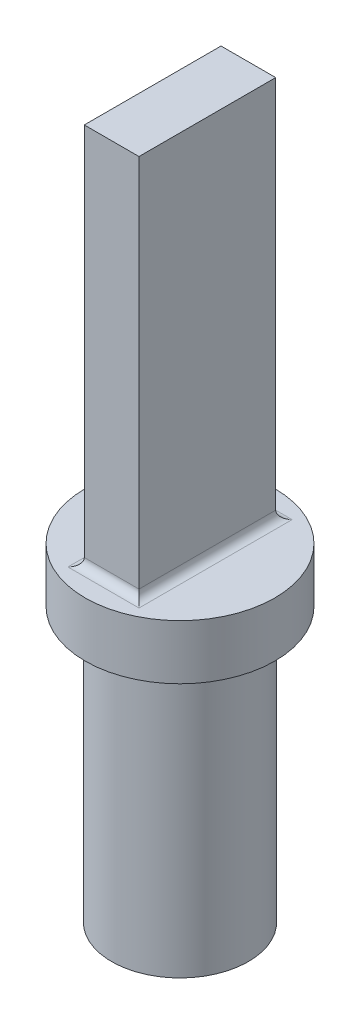
ISO-10303-21;
HEADER;
FILE_DESCRIPTION(('STEP AP214'),'2;1');
FILE_NAME('part.step','',(''),(''),'','','');
FILE_SCHEMA(('AUTOMOTIVE_DESIGN { 1 0 10303 214 1 1 1 1 }'));
ENDSEC;
DATA;
#1=APPLICATION_CONTEXT('core data for automotive mechanical design processes');
#2=APPLICATION_PROTOCOL_DEFINITION('international standard','automotive_design',2000,#1);
#3=PRODUCT_CONTEXT('',#1,'mechanical');
#4=PRODUCT('Part','Part','',(#3));
#5=PRODUCT_RELATED_PRODUCT_CATEGORY('part','',(#4));
#6=PRODUCT_DEFINITION_FORMATION('','',#4);
#7=PRODUCT_DEFINITION_CONTEXT('part definition',#1,'design');
#8=PRODUCT_DEFINITION('design','',#6,#7);
#9=PRODUCT_DEFINITION_SHAPE('','',#8);
#10=(LENGTH_UNIT() NAMED_UNIT(*) SI_UNIT(.MILLI.,.METRE.));
#11=(NAMED_UNIT(*) PLANE_ANGLE_UNIT() SI_UNIT($,.RADIAN.));
#12=(NAMED_UNIT(*) SI_UNIT($,.STERADIAN.) SOLID_ANGLE_UNIT());
#13=UNCERTAINTY_MEASURE_WITH_UNIT(LENGTH_MEASURE(1.E-05),#10,'distance_accuracy_value','');
#14=(GEOMETRIC_REPRESENTATION_CONTEXT(3) GLOBAL_UNCERTAINTY_ASSIGNED_CONTEXT((#13)) GLOBAL_UNIT_ASSIGNED_CONTEXT((#10,
#11,#12)) REPRESENTATION_CONTEXT('',''));
#15=CARTESIAN_POINT('',(0.,0.,0.));
#16=DIRECTION('',(0.,0.,1.));
#17=DIRECTION('',(1.,0.,0.));
#18=AXIS2_PLACEMENT_3D('',#15,#16,#17);
#19=CARTESIAN_POINT('',(0.,-10.,0.));
#20=DIRECTION('',(0.,1.,0.));
#21=DIRECTION('',(0.,0.,1.));
#22=AXIS2_PLACEMENT_3D('',#19,#20,#21);
#23=CYLINDRICAL_SURFACE('',#22,17.325);
#24=CARTESIAN_POINT('',(0.,-10.,0.));
#25=DIRECTION('',(0.,1.,0.));
#26=DIRECTION('',(0.,0.,1.));
#27=AXIS2_PLACEMENT_3D('',#24,#25,#26);
#28=CIRCLE('',#27,17.325);
#29=CARTESIAN_POINT('',(0.,-10.,17.325));
#30=VERTEX_POINT('',#29);
#31=EDGE_CURVE('E123',#30,#30,#28,.T.);
#32=ORIENTED_EDGE('',*,*,#31,.T.);
#33=EDGE_LOOP('',(#32));
#34=FACE_BOUND('',#33,.T.);
#35=CARTESIAN_POINT('',(0.,0.,0.));
#36=DIRECTION('',(0.,1.,0.));
#37=DIRECTION('',(0.,0.,1.));
#38=AXIS2_PLACEMENT_3D('',#35,#36,#37);
#39=CIRCLE('',#38,17.325);
#40=CARTESIAN_POINT('',(0.,0.,17.325));
#41=VERTEX_POINT('',#40);
#42=EDGE_CURVE('E113',#41,#41,#39,.T.);
#43=ORIENTED_EDGE('',*,*,#42,.F.);
#44=EDGE_LOOP('',(#43));
#45=FACE_BOUND('',#44,.T.);
#46=ADVANCED_FACE('F33',(#34,#45),#23,.T.);
#47=CARTESIAN_POINT('',(0.,-10.,0.));
#48=DIRECTION('',(0.,1.,0.));
#49=DIRECTION('',(0.,0.,1.));
#50=AXIS2_PLACEMENT_3D('',#47,#48,#49);
#51=PLANE('',#50);
#52=CARTESIAN_POINT('',(0.,-10.,0.));
#53=DIRECTION('',(0.,-1.,0.));
#54=DIRECTION('',(0.,0.,-1.));
#55=AXIS2_PLACEMENT_3D('',#52,#53,#54);
#56=CIRCLE('',#55,12.5);
#57=CARTESIAN_POINT('',(0.,-10.,-12.5));
#58=VERTEX_POINT('',#57);
#59=EDGE_CURVE('E119',#58,#58,#56,.T.);
#60=ORIENTED_EDGE('',*,*,#59,.F.);
#61=EDGE_LOOP('',(#60));
#62=FACE_BOUND('',#61,.T.);
#63=ORIENTED_EDGE('',*,*,#31,.F.);
#64=EDGE_LOOP('',(#63));
#65=FACE_BOUND('',#64,.T.);
#66=ADVANCED_FACE('F179',(#62,#65),#51,.F.);
#67=CARTESIAN_POINT('',(0.,0.,0.));
#68=DIRECTION('',(0.,1.,0.));
#69=DIRECTION('',(0.,0.,1.));
#70=AXIS2_PLACEMENT_3D('',#67,#68,#69);
#71=PLANE('',#70);
#72=DIRECTION('',(0.,0.,1.));
#73=VECTOR('',#72,1.);
#74=CARTESIAN_POINT('',(-6.5,0.,0.));
#75=LINE('',#74,#73);
#76=CARTESIAN_POINT('',(-6.5,0.,14.));
#77=VERTEX_POINT('',#76);
#78=CARTESIAN_POINT('',(-6.5,0.,-14.));
#79=VERTEX_POINT('',#78);
#80=EDGE_CURVE('E129',#77,#79,#75,.F.);
#81=ORIENTED_EDGE('',*,*,#80,.T.);
#82=DIRECTION('',(-1.,0.,0.));
#83=VECTOR('',#82,1.);
#84=CARTESIAN_POINT('',(0.,0.,-14.));
#85=LINE('',#84,#83);
#86=CARTESIAN_POINT('',(6.5,0.,-14.));
#87=VERTEX_POINT('',#86);
#88=EDGE_CURVE('E135',#79,#87,#85,.F.);
#89=ORIENTED_EDGE('',*,*,#88,.T.);
#90=DIRECTION('',(0.,0.,-1.));
#91=VECTOR('',#90,1.);
#92=CARTESIAN_POINT('',(6.5,0.,0.));
#93=LINE('',#92,#91);
#94=CARTESIAN_POINT('',(6.5,0.,14.));
#95=VERTEX_POINT('',#94);
#96=EDGE_CURVE('E133',#87,#95,#93,.F.);
#97=ORIENTED_EDGE('',*,*,#96,.T.);
#98=DIRECTION('',(1.,0.,0.));
#99=VECTOR('',#98,1.);
#100=CARTESIAN_POINT('',(0.,0.,14.));
#101=LINE('',#100,#99);
#102=EDGE_CURVE('E131',#95,#77,#101,.F.);
#103=ORIENTED_EDGE('',*,*,#102,.T.);
#104=EDGE_LOOP('',(#81,#89,#97,#103));
#105=FACE_BOUND('',#104,.T.);
#106=ORIENTED_EDGE('',*,*,#42,.T.);
#107=EDGE_LOOP('',(#106));
#108=FACE_BOUND('',#107,.T.);
#109=ADVANCED_FACE('F156',(#105,#108),#71,.T.);
#110=CARTESIAN_POINT('',(0.,-60.,0.));
#111=DIRECTION('',(0.,1.,0.));
#112=DIRECTION('',(0.,0.,1.));
#113=AXIS2_PLACEMENT_3D('',#110,#111,#112);
#114=CYLINDRICAL_SURFACE('',#113,12.5);
#115=CARTESIAN_POINT('',(0.,-60.,0.));
#116=DIRECTION('',(0.,-1.,0.));
#117=DIRECTION('',(0.,0.,-1.));
#118=AXIS2_PLACEMENT_3D('',#115,#116,#117);
#119=CIRCLE('',#118,12.5);
#120=CARTESIAN_POINT('',(0.,-60.,-12.5));
#121=VERTEX_POINT('',#120);
#122=EDGE_CURVE('E110',#121,#121,#119,.T.);
#123=ORIENTED_EDGE('',*,*,#122,.F.);
#124=EDGE_LOOP('',(#123));
#125=FACE_BOUND('',#124,.T.);
#126=ORIENTED_EDGE('',*,*,#59,.T.);
#127=EDGE_LOOP('',(#126));
#128=FACE_BOUND('',#127,.T.);
#129=ADVANCED_FACE('F219',(#125,#128),#114,.T.);
#130=CARTESIAN_POINT('',(0.,-60.,0.));
#131=DIRECTION('',(0.,-1.,0.));
#132=DIRECTION('',(0.,0.,-1.));
#133=AXIS2_PLACEMENT_3D('',#130,#131,#132);
#134=PLANE('',#133);
#135=ORIENTED_EDGE('',*,*,#122,.T.);
#136=EDGE_LOOP('',(#135));
#137=FACE_BOUND('',#136,.T.);
#138=ADVANCED_FACE('F210',(#137),#134,.T.);
#139=CARTESIAN_POINT('',(5.,70.,12.5));
#140=DIRECTION('',(-1.,0.,0.));
#141=DIRECTION('',(0.,0.,1.));
#142=AXIS2_PLACEMENT_3D('',#139,#140,#141);
#143=PLANE('',#142);
#144=DIRECTION('',(0.,-1.,0.));
#145=VECTOR('',#144,1.);
#146=CARTESIAN_POINT('',(5.,70.,12.5));
#147=LINE('',#146,#145);
#148=CARTESIAN_POINT('',(5.,70.,12.5));
#149=VERTEX_POINT('',#148);
#150=CARTESIAN_POINT('',(5.,1.5,12.5));
#151=VERTEX_POINT('',#150);
#152=EDGE_CURVE('E166',#149,#151,#147,.T.);
#153=ORIENTED_EDGE('',*,*,#152,.T.);
#154=DIRECTION('',(0.,0.,-1.));
#155=VECTOR('',#154,1.);
#156=CARTESIAN_POINT('',(5.,1.5,12.5));
#157=LINE('',#156,#155);
#158=CARTESIAN_POINT('',(5.,1.5,-12.5));
#159=VERTEX_POINT('',#158);
#160=EDGE_CURVE('E109',#151,#159,#157,.T.);
#161=ORIENTED_EDGE('',*,*,#160,.T.);
#162=DIRECTION('',(0.,-1.,0.));
#163=VECTOR('',#162,1.);
#164=CARTESIAN_POINT('',(5.,70.,-12.5));
#165=LINE('',#164,#163);
#166=CARTESIAN_POINT('',(5.,70.,-12.5));
#167=VERTEX_POINT('',#166);
#168=EDGE_CURVE('E93',#167,#159,#165,.T.);
#169=ORIENTED_EDGE('',*,*,#168,.F.);
#170=DIRECTION('',(0.,0.,-1.));
#171=VECTOR('',#170,1.);
#172=CARTESIAN_POINT('',(5.,70.,12.5));
#173=LINE('',#172,#171);
#174=EDGE_CURVE('E99',#149,#167,#173,.T.);
#175=ORIENTED_EDGE('',*,*,#174,.F.);
#176=EDGE_LOOP('',(#153,#161,#169,#175));
#177=FACE_BOUND('',#176,.T.);
#178=ADVANCED_FACE('F107',(#177),#143,.F.);
#179=CARTESIAN_POINT('',(5.,70.,-12.5));
#180=DIRECTION('',(0.,0.,1.));
#181=DIRECTION('',(1.,0.,0.));
#182=AXIS2_PLACEMENT_3D('',#179,#180,#181);
#183=PLANE('',#182);
#184=ORIENTED_EDGE('',*,*,#168,.T.);
#185=DIRECTION('',(-1.,0.,0.));
#186=VECTOR('',#185,1.);
#187=CARTESIAN_POINT('',(5.,1.5,-12.5));
#188=LINE('',#187,#186);
#189=CARTESIAN_POINT('',(-5.,1.5,-12.5));
#190=VERTEX_POINT('',#189);
#191=EDGE_CURVE('E122',#159,#190,#188,.T.);
#192=ORIENTED_EDGE('',*,*,#191,.T.);
#193=DIRECTION('',(0.,-1.,0.));
#194=VECTOR('',#193,1.);
#195=CARTESIAN_POINT('',(-5.,70.,-12.5));
#196=LINE('',#195,#194);
#197=CARTESIAN_POINT('',(-5.,70.,-12.5));
#198=VERTEX_POINT('',#197);
#199=EDGE_CURVE('E95',#198,#190,#196,.T.);
#200=ORIENTED_EDGE('',*,*,#199,.F.);
#201=DIRECTION('',(-1.,0.,0.));
#202=VECTOR('',#201,1.);
#203=CARTESIAN_POINT('',(5.,70.,-12.5));
#204=LINE('',#203,#202);
#205=EDGE_CURVE('E88',#167,#198,#204,.T.);
#206=ORIENTED_EDGE('',*,*,#205,.F.);
#207=EDGE_LOOP('',(#184,#192,#200,#206));
#208=FACE_BOUND('',#207,.T.);
#209=ADVANCED_FACE('F90',(#208),#183,.F.);
#210=CARTESIAN_POINT('',(-5.,70.,12.5));
#211=DIRECTION('',(1.,0.,0.));
#212=DIRECTION('',(0.,0.,-1.));
#213=AXIS2_PLACEMENT_3D('',#210,#211,#212);
#214=PLANE('',#213);
#215=ORIENTED_EDGE('',*,*,#199,.T.);
#216=DIRECTION('',(0.,0.,1.));
#217=VECTOR('',#216,1.);
#218=CARTESIAN_POINT('',(-5.,1.5,12.5));
#219=LINE('',#218,#217);
#220=CARTESIAN_POINT('',(-5.,1.5,12.5));
#221=VERTEX_POINT('',#220);
#222=EDGE_CURVE('E11',#190,#221,#219,.T.);
#223=ORIENTED_EDGE('',*,*,#222,.T.);
#224=DIRECTION('',(0.,-1.,0.));
#225=VECTOR('',#224,1.);
#226=CARTESIAN_POINT('',(-5.,70.,12.5));
#227=LINE('',#226,#225);
#228=CARTESIAN_POINT('',(-5.,70.,12.5));
#229=VERTEX_POINT('',#228);
#230=EDGE_CURVE('E115',#229,#221,#227,.T.);
#231=ORIENTED_EDGE('',*,*,#230,.F.);
#232=DIRECTION('',(0.,0.,1.));
#233=VECTOR('',#232,1.);
#234=CARTESIAN_POINT('',(-5.,70.,12.5));
#235=LINE('',#234,#233);
#236=EDGE_CURVE('E98',#198,#229,#235,.T.);
#237=ORIENTED_EDGE('',*,*,#236,.F.);
#238=EDGE_LOOP('',(#215,#223,#231,#237));
#239=FACE_BOUND('',#238,.T.);
#240=ADVANCED_FACE('F164',(#239),#214,.F.);
#241=CARTESIAN_POINT('',(5.,70.,12.5));
#242=DIRECTION('',(0.,0.,-1.));
#243=DIRECTION('',(-1.,0.,0.));
#244=AXIS2_PLACEMENT_3D('',#241,#242,#243);
#245=PLANE('',#244);
#246=ORIENTED_EDGE('',*,*,#230,.T.);
#247=DIRECTION('',(1.,0.,0.));
#248=VECTOR('',#247,1.);
#249=CARTESIAN_POINT('',(5.,1.5,12.5));
#250=LINE('',#249,#248);
#251=EDGE_CURVE('E42',#221,#151,#250,.T.);
#252=ORIENTED_EDGE('',*,*,#251,.T.);
#253=ORIENTED_EDGE('',*,*,#152,.F.);
#254=DIRECTION('',(1.,0.,0.));
#255=VECTOR('',#254,1.);
#256=CARTESIAN_POINT('',(5.,70.,12.5));
#257=LINE('',#256,#255);
#258=EDGE_CURVE('E104',#229,#149,#257,.T.);
#259=ORIENTED_EDGE('',*,*,#258,.F.);
#260=EDGE_LOOP('',(#246,#252,#253,#259));
#261=FACE_BOUND('',#260,.T.);
#262=ADVANCED_FACE('F169',(#261),#245,.F.);
#263=CARTESIAN_POINT('',(0.,70.,0.));
#264=DIRECTION('',(0.,1.,0.));
#265=DIRECTION('',(0.,0.,1.));
#266=AXIS2_PLACEMENT_3D('',#263,#264,#265);
#267=PLANE('',#266);
#268=ORIENTED_EDGE('',*,*,#174,.T.);
#269=ORIENTED_EDGE('',*,*,#205,.T.);
#270=ORIENTED_EDGE('',*,*,#236,.T.);
#271=ORIENTED_EDGE('',*,*,#258,.T.);
#272=EDGE_LOOP('',(#268,#269,#270,#271));
#273=FACE_BOUND('',#272,.T.);
#274=ADVANCED_FACE('F102',(#273),#267,.T.);
#275=CARTESIAN_POINT('',(5.,1.5,14.));
#276=DIRECTION('',(1.,0.,0.));
#277=DIRECTION('',(0.,0.,-1.));
#278=AXIS2_PLACEMENT_3D('',#275,#276,#277);
#279=CYLINDRICAL_SURFACE('',#278,1.5);
#280=CARTESIAN_POINT('',(-6.5,1.5,14.));
#281=DIRECTION('',(0.707106781186548,0.,0.707106781186547));
#282=DIRECTION('',(-0.707106781186547,0.,0.707106781186548));
#283=AXIS2_PLACEMENT_3D('',#280,#281,#282);
#284=ELLIPSE('',#283,2.12132034355964,1.5);
#285=EDGE_CURVE('E143',#77,#221,#284,.T.);
#286=ORIENTED_EDGE('',*,*,#285,.F.);
#287=ORIENTED_EDGE('',*,*,#102,.F.);
#288=CARTESIAN_POINT('',(6.5,1.5,14.));
#289=DIRECTION('',(0.707106781186547,0.,-0.707106781186548));
#290=DIRECTION('',(0.707106781186548,0.,0.707106781186547));
#291=AXIS2_PLACEMENT_3D('',#288,#289,#290);
#292=ELLIPSE('',#291,2.12132034355964,1.5);
#293=EDGE_CURVE('E37',#151,#95,#292,.F.);
#294=ORIENTED_EDGE('',*,*,#293,.F.);
#295=ORIENTED_EDGE('',*,*,#251,.F.);
#296=EDGE_LOOP('',(#286,#287,#294,#295));
#297=FACE_BOUND('',#296,.T.);
#298=ADVANCED_FACE('F35',(#297),#279,.F.);
#299=CARTESIAN_POINT('',(6.5,1.5,12.5));
#300=DIRECTION('',(0.,0.,-1.));
#301=DIRECTION('',(-1.,0.,0.));
#302=AXIS2_PLACEMENT_3D('',#299,#300,#301);
#303=CYLINDRICAL_SURFACE('',#302,1.5);
#304=ORIENTED_EDGE('',*,*,#293,.T.);
#305=ORIENTED_EDGE('',*,*,#96,.F.);
#306=CARTESIAN_POINT('',(6.5,1.5,-14.));
#307=DIRECTION('',(-0.707106781186547,0.,-0.707106781186547));
#308=DIRECTION('',(0.707106781186547,0.,-0.707106781186547));
#309=AXIS2_PLACEMENT_3D('',#306,#307,#308);
#310=ELLIPSE('',#309,2.12132034355964,1.5);
#311=EDGE_CURVE('E142',#159,#87,#310,.F.);
#312=ORIENTED_EDGE('',*,*,#311,.F.);
#313=ORIENTED_EDGE('',*,*,#160,.F.);
#314=EDGE_LOOP('',(#304,#305,#312,#313));
#315=FACE_BOUND('',#314,.T.);
#316=ADVANCED_FACE('F152',(#315),#303,.F.);
#317=CARTESIAN_POINT('',(-6.5,1.5,12.5));
#318=DIRECTION('',(0.,0.,1.));
#319=DIRECTION('',(1.,0.,0.));
#320=AXIS2_PLACEMENT_3D('',#317,#318,#319);
#321=CYLINDRICAL_SURFACE('',#320,1.5);
#322=ORIENTED_EDGE('',*,*,#285,.T.);
#323=ORIENTED_EDGE('',*,*,#222,.F.);
#324=CARTESIAN_POINT('',(-6.5,1.5,-14.));
#325=DIRECTION('',(-0.707106781186547,0.,0.707106781186547));
#326=DIRECTION('',(0.707106781186547,0.,0.707106781186547));
#327=AXIS2_PLACEMENT_3D('',#324,#325,#326);
#328=ELLIPSE('',#327,2.12132034355964,1.5);
#329=EDGE_CURVE('E140',#79,#190,#328,.T.);
#330=ORIENTED_EDGE('',*,*,#329,.F.);
#331=ORIENTED_EDGE('',*,*,#80,.F.);
#332=EDGE_LOOP('',(#322,#323,#330,#331));
#333=FACE_BOUND('',#332,.T.);
#334=ADVANCED_FACE('F163',(#333),#321,.F.);
#335=CARTESIAN_POINT('',(5.,1.5,-14.));
#336=DIRECTION('',(-1.,0.,0.));
#337=DIRECTION('',(0.,0.,1.));
#338=AXIS2_PLACEMENT_3D('',#335,#336,#337);
#339=CYLINDRICAL_SURFACE('',#338,1.5);
#340=ORIENTED_EDGE('',*,*,#311,.T.);
#341=ORIENTED_EDGE('',*,*,#88,.F.);
#342=ORIENTED_EDGE('',*,*,#329,.T.);
#343=ORIENTED_EDGE('',*,*,#191,.F.);
#344=EDGE_LOOP('',(#340,#341,#342,#343));
#345=FACE_BOUND('',#344,.T.);
#346=ADVANCED_FACE('F161',(#345),#339,.F.);
#347=CLOSED_SHELL('',(#46,#66,#109,#129,#138,#178,#209,#240,#262,#274,#298,#316,#334,#346));
#348=MANIFOLD_SOLID_BREP('B2',#347);
#349=ADVANCED_BREP_SHAPE_REPRESENTATION('',(#18,#348),#14);
#350=SHAPE_DEFINITION_REPRESENTATION(#9,#349);
ENDSEC;
END-ISO-10303-21;
